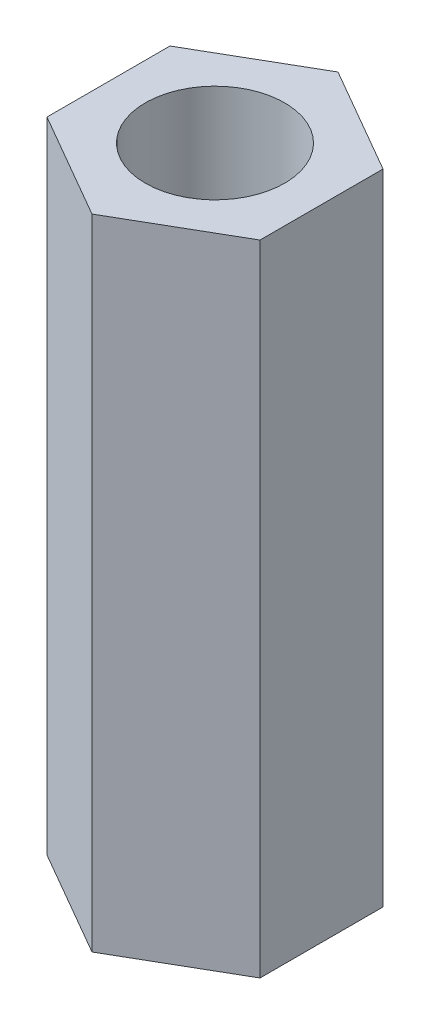
ISO-10303-21;
HEADER;
FILE_DESCRIPTION(('STEP AP214'),'2;1');
FILE_NAME('part.step','',(''),(''),'','','');
FILE_SCHEMA(('AUTOMOTIVE_DESIGN { 1 0 10303 214 1 1 1 1 }'));
ENDSEC;
DATA;
#1=APPLICATION_CONTEXT('core data for automotive mechanical design processes');
#2=APPLICATION_PROTOCOL_DEFINITION('international standard','automotive_design',2000,#1);
#3=PRODUCT_CONTEXT('',#1,'mechanical');
#4=PRODUCT('Part','Part','',(#3));
#5=PRODUCT_RELATED_PRODUCT_CATEGORY('part','',(#4));
#6=PRODUCT_DEFINITION_FORMATION('','',#4);
#7=PRODUCT_DEFINITION_CONTEXT('part definition',#1,'design');
#8=PRODUCT_DEFINITION('design','',#6,#7);
#9=PRODUCT_DEFINITION_SHAPE('','',#8);
#10=(LENGTH_UNIT() NAMED_UNIT(*) SI_UNIT(.MILLI.,.METRE.));
#11=(NAMED_UNIT(*) PLANE_ANGLE_UNIT() SI_UNIT($,.RADIAN.));
#12=(NAMED_UNIT(*) SI_UNIT($,.STERADIAN.) SOLID_ANGLE_UNIT());
#13=UNCERTAINTY_MEASURE_WITH_UNIT(LENGTH_MEASURE(1.E-05),#10,'distance_accuracy_value','');
#14=(GEOMETRIC_REPRESENTATION_CONTEXT(3) GLOBAL_UNCERTAINTY_ASSIGNED_CONTEXT((#13)) GLOBAL_UNIT_ASSIGNED_CONTEXT((#10,
#11,#12)) REPRESENTATION_CONTEXT('',''));
#15=CARTESIAN_POINT('',(0.,0.,0.));
#16=DIRECTION('',(0.,0.,1.));
#17=DIRECTION('',(1.,0.,0.));
#18=AXIS2_PLACEMENT_3D('',#15,#16,#17);
#19=CARTESIAN_POINT('',(0.,15.,0.));
#20=DIRECTION('',(0.,-1.,0.));
#21=DIRECTION('',(0.,0.,-1.));
#22=AXIS2_PLACEMENT_3D('',#19,#20,#21);
#23=PLANE('',#22);
#24=DIRECTION('',(-0.86602542888642,0.,-0.49999995652209));
#25=VECTOR('',#24,1.);
#26=CARTESIAN_POINT('',(-1.44938846189692E-07,15.,-2.887));
#27=LINE('',#26,#25);
#28=CARTESIAN_POINT('',(2.50021526825625,15.,-1.44350012552072));
#29=VERTEX_POINT('',#28);
#30=CARTESIAN_POINT('',(-1.44938846189692E-07,15.,-2.887));
#31=VERTEX_POINT('',#30);
#32=EDGE_CURVE('E130',#29,#31,#27,.T.);
#33=ORIENTED_EDGE('',*,*,#32,.T.);
#34=DIRECTION('',(-0.866025378682455,0.,0.500000043477908));
#35=VECTOR('',#34,1.);
#36=CARTESIAN_POINT('',(-2.50021541319509,15.,-1.44349987447928));
#37=LINE('',#36,#35);
#38=CARTESIAN_POINT('',(-2.50021541319509,15.,-1.44349987447928));
#39=VERTEX_POINT('',#38);
#40=EDGE_CURVE('E88',#31,#39,#37,.T.);
#41=ORIENTED_EDGE('',*,*,#40,.T.);
#42=DIRECTION('',(5.02039646973577E-08,0.,0.999999999999999));
#43=VECTOR('',#42,1.);
#44=CARTESIAN_POINT('',(-2.50021526825625,15.,1.44350012552072));
#45=LINE('',#44,#43);
#46=CARTESIAN_POINT('',(-2.50021526825625,15.,1.44350012552072));
#47=VERTEX_POINT('',#46);
#48=EDGE_CURVE('E101',#39,#47,#45,.T.);
#49=ORIENTED_EDGE('',*,*,#48,.T.);
#50=DIRECTION('',(0.86602542888642,0.,0.49999995652209));
#51=VECTOR('',#50,1.);
#52=CARTESIAN_POINT('',(1.44938846487848E-07,15.,2.887));
#53=LINE('',#52,#51);
#54=CARTESIAN_POINT('',(1.44938846487848E-07,15.,2.887));
#55=VERTEX_POINT('',#54);
#56=EDGE_CURVE('E95',#47,#55,#53,.T.);
#57=ORIENTED_EDGE('',*,*,#56,.T.);
#58=DIRECTION('',(0.866025378682455,0.,-0.500000043477908));
#59=VECTOR('',#58,1.);
#60=CARTESIAN_POINT('',(2.50021541319509,15.,1.44349987447928));
#61=LINE('',#60,#59);
#62=CARTESIAN_POINT('',(2.50021541319509,15.,1.44349987447928));
#63=VERTEX_POINT('',#62);
#64=EDGE_CURVE('E99',#55,#63,#61,.T.);
#65=ORIENTED_EDGE('',*,*,#64,.T.);
#66=DIRECTION('',(-5.02039645471391E-08,0.,-0.999999999999999));
#67=VECTOR('',#66,1.);
#68=CARTESIAN_POINT('',(2.50021526825625,15.,-1.44350012552072));
#69=LINE('',#68,#67);
#70=EDGE_CURVE('E51',#63,#29,#69,.T.);
#71=ORIENTED_EDGE('',*,*,#70,.T.);
#72=EDGE_LOOP('',(#33,#41,#49,#57,#65,#71));
#73=FACE_BOUND('',#72,.T.);
#74=CARTESIAN_POINT('',(0.,15.,0.));
#75=DIRECTION('',(0.,1.,0.));
#76=DIRECTION('',(0.,0.,1.));
#77=AXIS2_PLACEMENT_3D('',#74,#75,#76);
#78=CIRCLE('',#77,1.635);
#79=CARTESIAN_POINT('',(0.,15.,1.635));
#80=VERTEX_POINT('',#79);
#81=EDGE_CURVE('E123',#80,#80,#78,.T.);
#82=ORIENTED_EDGE('',*,*,#81,.F.);
#83=EDGE_LOOP('',(#82));
#84=FACE_BOUND('',#83,.T.);
#85=ADVANCED_FACE('F34',(#73,#84),#23,.F.);
#86=CARTESIAN_POINT('',(0.,0.,0.));
#87=DIRECTION('',(0.,-1.,0.));
#88=DIRECTION('',(0.,0.,-1.));
#89=AXIS2_PLACEMENT_3D('',#86,#87,#88);
#90=PLANE('',#89);
#91=DIRECTION('',(-0.86602542888642,0.,-0.49999995652209));
#92=VECTOR('',#91,1.);
#93=CARTESIAN_POINT('',(-1.44938846189692E-07,0.,-2.887));
#94=LINE('',#93,#92);
#95=CARTESIAN_POINT('',(2.50021526825625,0.,-1.44350012552072));
#96=VERTEX_POINT('',#95);
#97=CARTESIAN_POINT('',(-1.44938846189692E-07,0.,-2.887));
#98=VERTEX_POINT('',#97);
#99=EDGE_CURVE('E119',#96,#98,#94,.T.);
#100=ORIENTED_EDGE('',*,*,#99,.F.);
#101=DIRECTION('',(-5.02039645471391E-08,0.,-0.999999999999999));
#102=VECTOR('',#101,1.);
#103=CARTESIAN_POINT('',(2.50021526825625,0.,-1.44350012552072));
#104=LINE('',#103,#102);
#105=CARTESIAN_POINT('',(2.50021541319509,0.,1.44349987447928));
#106=VERTEX_POINT('',#105);
#107=EDGE_CURVE('E80',#106,#96,#104,.T.);
#108=ORIENTED_EDGE('',*,*,#107,.F.);
#109=DIRECTION('',(0.866025378682455,0.,-0.500000043477908));
#110=VECTOR('',#109,1.);
#111=CARTESIAN_POINT('',(2.50021541319509,0.,1.44349987447928));
#112=LINE('',#111,#110);
#113=CARTESIAN_POINT('',(1.44938846487848E-07,0.,2.887));
#114=VERTEX_POINT('',#113);
#115=EDGE_CURVE('E74',#114,#106,#112,.T.);
#116=ORIENTED_EDGE('',*,*,#115,.F.);
#117=DIRECTION('',(0.86602542888642,0.,0.49999995652209));
#118=VECTOR('',#117,1.);
#119=CARTESIAN_POINT('',(1.44938846487848E-07,0.,2.887));
#120=LINE('',#119,#118);
#121=CARTESIAN_POINT('',(-2.50021526825625,0.,1.44350012552072));
#122=VERTEX_POINT('',#121);
#123=EDGE_CURVE('E109',#122,#114,#120,.T.);
#124=ORIENTED_EDGE('',*,*,#123,.F.);
#125=DIRECTION('',(5.02039646973577E-08,0.,0.999999999999999));
#126=VECTOR('',#125,1.);
#127=CARTESIAN_POINT('',(-2.50021526825625,0.,1.44350012552072));
#128=LINE('',#127,#126);
#129=CARTESIAN_POINT('',(-2.50021541319509,0.,-1.44349987447928));
#130=VERTEX_POINT('',#129);
#131=EDGE_CURVE('E125',#130,#122,#128,.T.);
#132=ORIENTED_EDGE('',*,*,#131,.F.);
#133=DIRECTION('',(-0.866025378682455,0.,0.500000043477908));
#134=VECTOR('',#133,1.);
#135=CARTESIAN_POINT('',(-2.50021541319509,0.,-1.44349987447928));
#136=LINE('',#135,#134);
#137=EDGE_CURVE('E122',#98,#130,#136,.T.);
#138=ORIENTED_EDGE('',*,*,#137,.F.);
#139=EDGE_LOOP('',(#100,#108,#116,#124,#132,#138));
#140=FACE_BOUND('',#139,.T.);
#141=CARTESIAN_POINT('',(0.,0.,0.));
#142=DIRECTION('',(0.,1.,0.));
#143=DIRECTION('',(0.,0.,1.));
#144=AXIS2_PLACEMENT_3D('',#141,#142,#143);
#145=CIRCLE('',#144,1.635);
#146=CARTESIAN_POINT('',(0.,0.,1.635));
#147=VERTEX_POINT('',#146);
#148=EDGE_CURVE('E223',#147,#147,#145,.T.);
#149=ORIENTED_EDGE('',*,*,#148,.T.);
#150=EDGE_LOOP('',(#149));
#151=FACE_BOUND('',#150,.T.);
#152=ADVANCED_FACE('F139',(#140,#151),#90,.T.);
#153=CARTESIAN_POINT('',(-1.44938846189692E-07,15.,-2.887));
#154=DIRECTION('',(-0.499999956522091,0.,0.86602542888642));
#155=DIRECTION('',(0.86602542888642,0.,0.499999956522091));
#156=AXIS2_PLACEMENT_3D('',#153,#154,#155);
#157=PLANE('',#156);
#158=ORIENTED_EDGE('',*,*,#99,.T.);
#159=DIRECTION('',(0.,-1.,0.));
#160=VECTOR('',#159,1.);
#161=CARTESIAN_POINT('',(-1.44938846189692E-07,15.,-2.887));
#162=LINE('',#161,#160);
#163=EDGE_CURVE('E11',#31,#98,#162,.T.);
#164=ORIENTED_EDGE('',*,*,#163,.F.);
#165=ORIENTED_EDGE('',*,*,#32,.F.);
#166=DIRECTION('',(0.,-1.,0.));
#167=VECTOR('',#166,1.);
#168=CARTESIAN_POINT('',(2.50021526825625,15.,-1.44350012552072));
#169=LINE('',#168,#167);
#170=EDGE_CURVE('E115',#29,#96,#169,.T.);
#171=ORIENTED_EDGE('',*,*,#170,.T.);
#172=EDGE_LOOP('',(#158,#164,#165,#171));
#173=FACE_BOUND('',#172,.T.);
#174=ADVANCED_FACE('F36',(#173),#157,.F.);
#175=CARTESIAN_POINT('',(-2.50021541319509,15.,-1.44349987447928));
#176=DIRECTION('',(0.500000043477908,0.,0.866025378682455));
#177=DIRECTION('',(0.866025378682455,0.,-0.500000043477908));
#178=AXIS2_PLACEMENT_3D('',#175,#176,#177);
#179=PLANE('',#178);
#180=ORIENTED_EDGE('',*,*,#137,.T.);
#181=DIRECTION('',(0.,-1.,0.));
#182=VECTOR('',#181,1.);
#183=CARTESIAN_POINT('',(-2.50021541319509,15.,-1.44349987447928));
#184=LINE('',#183,#182);
#185=EDGE_CURVE('E43',#39,#130,#184,.T.);
#186=ORIENTED_EDGE('',*,*,#185,.F.);
#187=ORIENTED_EDGE('',*,*,#40,.F.);
#188=ORIENTED_EDGE('',*,*,#163,.T.);
#189=EDGE_LOOP('',(#180,#186,#187,#188));
#190=FACE_BOUND('',#189,.T.);
#191=ADVANCED_FACE('F164',(#190),#179,.F.);
#192=CARTESIAN_POINT('',(-2.50021526825625,15.,1.44350012552072));
#193=DIRECTION('',(0.999999999999999,0.,-5.02039646973577E-08));
#194=DIRECTION('',(-5.02039646973577E-08,0.,-0.999999999999999));
#195=AXIS2_PLACEMENT_3D('',#192,#193,#194);
#196=PLANE('',#195);
#197=ORIENTED_EDGE('',*,*,#131,.T.);
#198=DIRECTION('',(0.,-1.,0.));
#199=VECTOR('',#198,1.);
#200=CARTESIAN_POINT('',(-2.50021526825625,15.,1.44350012552072));
#201=LINE('',#200,#199);
#202=EDGE_CURVE('E110',#47,#122,#201,.T.);
#203=ORIENTED_EDGE('',*,*,#202,.F.);
#204=ORIENTED_EDGE('',*,*,#48,.F.);
#205=ORIENTED_EDGE('',*,*,#185,.T.);
#206=EDGE_LOOP('',(#197,#203,#204,#205));
#207=FACE_BOUND('',#206,.T.);
#208=ADVANCED_FACE('F136',(#207),#196,.F.);
#209=CARTESIAN_POINT('',(1.44938846487848E-07,15.,2.887));
#210=DIRECTION('',(0.499999956522091,0.,-0.86602542888642));
#211=DIRECTION('',(-0.86602542888642,0.,-0.499999956522091));
#212=AXIS2_PLACEMENT_3D('',#209,#210,#211);
#213=PLANE('',#212);
#214=ORIENTED_EDGE('',*,*,#123,.T.);
#215=DIRECTION('',(0.,-1.,0.));
#216=VECTOR('',#215,1.);
#217=CARTESIAN_POINT('',(1.44938846487848E-07,15.,2.887));
#218=LINE('',#217,#216);
#219=EDGE_CURVE('E106',#55,#114,#218,.T.);
#220=ORIENTED_EDGE('',*,*,#219,.F.);
#221=ORIENTED_EDGE('',*,*,#56,.F.);
#222=ORIENTED_EDGE('',*,*,#202,.T.);
#223=EDGE_LOOP('',(#214,#220,#221,#222));
#224=FACE_BOUND('',#223,.T.);
#225=ADVANCED_FACE('F107',(#224),#213,.F.);
#226=CARTESIAN_POINT('',(2.50021541319509,15.,1.44349987447928));
#227=DIRECTION('',(-0.500000043477908,0.,-0.866025378682455));
#228=DIRECTION('',(-0.866025378682455,0.,0.500000043477908));
#229=AXIS2_PLACEMENT_3D('',#226,#227,#228);
#230=PLANE('',#229);
#231=ORIENTED_EDGE('',*,*,#115,.T.);
#232=DIRECTION('',(0.,-1.,0.));
#233=VECTOR('',#232,1.);
#234=CARTESIAN_POINT('',(2.50021541319509,15.,1.44349987447928));
#235=LINE('',#234,#233);
#236=EDGE_CURVE('E111',#63,#106,#235,.T.);
#237=ORIENTED_EDGE('',*,*,#236,.F.);
#238=ORIENTED_EDGE('',*,*,#64,.F.);
#239=ORIENTED_EDGE('',*,*,#219,.T.);
#240=EDGE_LOOP('',(#231,#237,#238,#239));
#241=FACE_BOUND('',#240,.T.);
#242=ADVANCED_FACE('F113',(#241),#230,.F.);
#243=CARTESIAN_POINT('',(2.50021526825625,15.,-1.44350012552072));
#244=DIRECTION('',(-0.999999999999999,0.,5.02039645471391E-08));
#245=DIRECTION('',(5.02039645471391E-08,0.,0.999999999999999));
#246=AXIS2_PLACEMENT_3D('',#243,#244,#245);
#247=PLANE('',#246);
#248=ORIENTED_EDGE('',*,*,#107,.T.);
#249=ORIENTED_EDGE('',*,*,#170,.F.);
#250=ORIENTED_EDGE('',*,*,#70,.F.);
#251=ORIENTED_EDGE('',*,*,#236,.T.);
#252=EDGE_LOOP('',(#248,#249,#250,#251));
#253=FACE_BOUND('',#252,.T.);
#254=ADVANCED_FACE('F144',(#253),#247,.F.);
#255=CARTESIAN_POINT('',(0.,15.,0.));
#256=DIRECTION('',(0.,-1.,0.));
#257=DIRECTION('',(0.,0.,-1.));
#258=AXIS2_PLACEMENT_3D('',#255,#256,#257);
#259=CYLINDRICAL_SURFACE('',#258,1.635);
#260=ORIENTED_EDGE('',*,*,#81,.T.);
#261=EDGE_LOOP('',(#260));
#262=FACE_BOUND('',#261,.T.);
#263=ORIENTED_EDGE('',*,*,#148,.F.);
#264=EDGE_LOOP('',(#263));
#265=FACE_BOUND('',#264,.T.);
#266=ADVANCED_FACE('F146',(#262,#265),#259,.F.);
#267=CLOSED_SHELL('',(#85,#152,#174,#191,#208,#225,#242,#254,#266));
#268=MANIFOLD_SOLID_BREP('B2',#267);
#269=ADVANCED_BREP_SHAPE_REPRESENTATION('',(#18,#268),#14);
#270=SHAPE_DEFINITION_REPRESENTATION(#9,#269);
ENDSEC;
END-ISO-10303-21;
